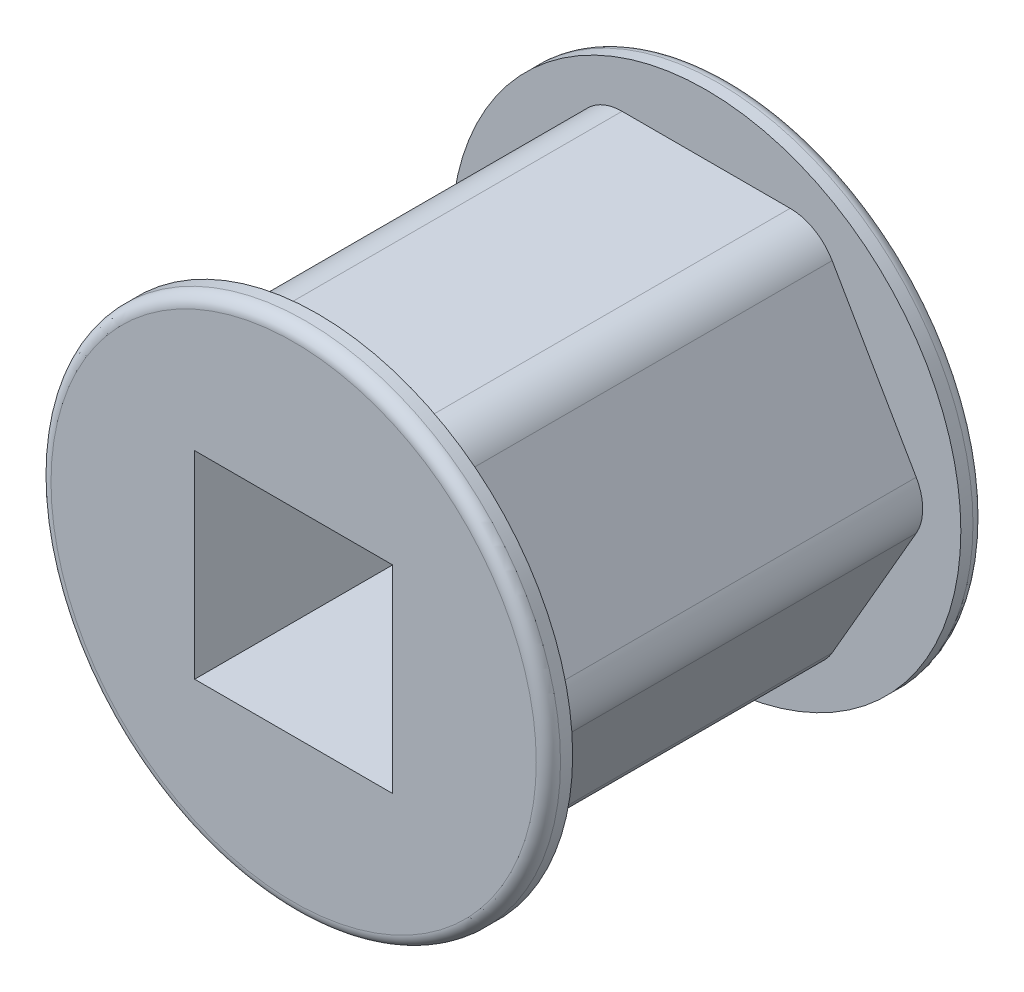
ISO-10303-21;
HEADER;
FILE_DESCRIPTION(('STEP AP214'),'2;1');
FILE_NAME('part.step','',(''),(''),'','','');
FILE_SCHEMA(('AUTOMOTIVE_DESIGN { 1 0 10303 214 1 1 1 1 }'));
ENDSEC;
DATA;
#1=APPLICATION_CONTEXT('core data for automotive mechanical design processes');
#2=APPLICATION_PROTOCOL_DEFINITION('international standard','automotive_design',2000,#1);
#3=PRODUCT_CONTEXT('',#1,'mechanical');
#4=PRODUCT('Part','Part','',(#3));
#5=PRODUCT_RELATED_PRODUCT_CATEGORY('part','',(#4));
#6=PRODUCT_DEFINITION_FORMATION('','',#4);
#7=PRODUCT_DEFINITION_CONTEXT('part definition',#1,'design');
#8=PRODUCT_DEFINITION('design','',#6,#7);
#9=PRODUCT_DEFINITION_SHAPE('','',#8);
#10=(LENGTH_UNIT() NAMED_UNIT(*) SI_UNIT(.MILLI.,.METRE.));
#11=(NAMED_UNIT(*) PLANE_ANGLE_UNIT() SI_UNIT($,.RADIAN.));
#12=(NAMED_UNIT(*) SI_UNIT($,.STERADIAN.) SOLID_ANGLE_UNIT());
#13=UNCERTAINTY_MEASURE_WITH_UNIT(LENGTH_MEASURE(1.E-05),#10,'distance_accuracy_value','');
#14=(GEOMETRIC_REPRESENTATION_CONTEXT(3) GLOBAL_UNCERTAINTY_ASSIGNED_CONTEXT((#13)) GLOBAL_UNIT_ASSIGNED_CONTEXT((#10,
#11,#12)) REPRESENTATION_CONTEXT('',''));
#15=CARTESIAN_POINT('',(0.,0.,0.));
#16=DIRECTION('',(0.,0.,1.));
#17=DIRECTION('',(1.,0.,0.));
#18=AXIS2_PLACEMENT_3D('',#15,#16,#17);
#19=CARTESIAN_POINT('',(3.2385,-3.2385,0.79375));
#20=DIRECTION('',(-1.,0.,0.));
#21=DIRECTION('',(0.,0.,1.));
#22=AXIS2_PLACEMENT_3D('',#19,#20,#21);
#23=PLANE('',#22);
#24=DIRECTION('',(0.,0.,-1.));
#25=VECTOR('',#24,1.);
#26=CARTESIAN_POINT('',(3.2385,3.2385,0.79375));
#27=LINE('',#26,#25);
#28=CARTESIAN_POINT('',(3.2385,3.2385,14.2875));
#29=VERTEX_POINT('',#28);
#30=CARTESIAN_POINT('',(3.2385,3.2385,0.));
#31=VERTEX_POINT('',#30);
#32=EDGE_CURVE('E170',#29,#31,#27,.T.);
#33=ORIENTED_EDGE('',*,*,#32,.T.);
#34=DIRECTION('',(0.,1.,0.));
#35=VECTOR('',#34,1.);
#36=CARTESIAN_POINT('',(3.2385,3.2385,0.));
#37=LINE('',#36,#35);
#38=CARTESIAN_POINT('',(3.2385,-3.2385,0.));
#39=VERTEX_POINT('',#38);
#40=EDGE_CURVE('E190',#39,#31,#37,.T.);
#41=ORIENTED_EDGE('',*,*,#40,.F.);
#42=DIRECTION('',(0.,0.,-1.));
#43=VECTOR('',#42,1.);
#44=CARTESIAN_POINT('',(3.2385,-3.2385,0.79375));
#45=LINE('',#44,#43);
#46=CARTESIAN_POINT('',(3.2385,-3.2385,14.2875));
#47=VERTEX_POINT('',#46);
#48=EDGE_CURVE('E260',#47,#39,#45,.T.);
#49=ORIENTED_EDGE('',*,*,#48,.F.);
#50=DIRECTION('',(0.,-1.,0.));
#51=VECTOR('',#50,1.);
#52=CARTESIAN_POINT('',(3.2385,3.2385,14.2875));
#53=LINE('',#52,#51);
#54=EDGE_CURVE('E185',#29,#47,#53,.T.);
#55=ORIENTED_EDGE('',*,*,#54,.F.);
#56=EDGE_LOOP('',(#33,#41,#49,#55));
#57=FACE_BOUND('',#56,.T.);
#58=ADVANCED_FACE('F43',(#57),#23,.T.);
#59=CARTESIAN_POINT('',(-3.2385,3.2385,0.79375));
#60=DIRECTION('',(0.,-1.,0.));
#61=DIRECTION('',(0.,0.,-1.));
#62=AXIS2_PLACEMENT_3D('',#59,#60,#61);
#63=PLANE('',#62);
#64=DIRECTION('',(0.,0.,-1.));
#65=VECTOR('',#64,1.);
#66=CARTESIAN_POINT('',(-3.2385,3.2385,0.79375));
#67=LINE('',#66,#65);
#68=CARTESIAN_POINT('',(-3.2385,3.2385,14.2875));
#69=VERTEX_POINT('',#68);
#70=CARTESIAN_POINT('',(-3.2385,3.2385,0.));
#71=VERTEX_POINT('',#70);
#72=EDGE_CURVE('E160',#69,#71,#67,.T.);
#73=ORIENTED_EDGE('',*,*,#72,.T.);
#74=DIRECTION('',(-1.,0.,0.));
#75=VECTOR('',#74,1.);
#76=CARTESIAN_POINT('',(-3.2385,3.2385,0.));
#77=LINE('',#76,#75);
#78=EDGE_CURVE('E188',#31,#71,#77,.T.);
#79=ORIENTED_EDGE('',*,*,#78,.F.);
#80=ORIENTED_EDGE('',*,*,#32,.F.);
#81=DIRECTION('',(1.,0.,0.));
#82=VECTOR('',#81,1.);
#83=CARTESIAN_POINT('',(-3.2385,3.2385,14.2875));
#84=LINE('',#83,#82);
#85=EDGE_CURVE('E174',#69,#29,#84,.T.);
#86=ORIENTED_EDGE('',*,*,#85,.F.);
#87=EDGE_LOOP('',(#73,#79,#80,#86));
#88=FACE_BOUND('',#87,.T.);
#89=ADVANCED_FACE('F181',(#88),#63,.T.);
#90=CARTESIAN_POINT('',(-3.2385,-3.2385,0.79375));
#91=DIRECTION('',(1.,0.,0.));
#92=DIRECTION('',(0.,0.,-1.));
#93=AXIS2_PLACEMENT_3D('',#90,#91,#92);
#94=PLANE('',#93);
#95=DIRECTION('',(0.,0.,-1.));
#96=VECTOR('',#95,1.);
#97=CARTESIAN_POINT('',(-3.2385,-3.2385,0.79375));
#98=LINE('',#97,#96);
#99=CARTESIAN_POINT('',(-3.2385,-3.2385,14.2875));
#100=VERTEX_POINT('',#99);
#101=CARTESIAN_POINT('',(-3.2385,-3.2385,0.));
#102=VERTEX_POINT('',#101);
#103=EDGE_CURVE('E166',#100,#102,#98,.T.);
#104=ORIENTED_EDGE('',*,*,#103,.T.);
#105=DIRECTION('',(0.,-1.,0.));
#106=VECTOR('',#105,1.);
#107=CARTESIAN_POINT('',(-3.2385,-3.2385,0.));
#108=LINE('',#107,#106);
#109=EDGE_CURVE('E162',#71,#102,#108,.T.);
#110=ORIENTED_EDGE('',*,*,#109,.F.);
#111=ORIENTED_EDGE('',*,*,#72,.F.);
#112=DIRECTION('',(0.,1.,0.));
#113=VECTOR('',#112,1.);
#114=CARTESIAN_POINT('',(-3.2385,-3.2385,14.2875));
#115=LINE('',#114,#113);
#116=EDGE_CURVE('E159',#100,#69,#115,.T.);
#117=ORIENTED_EDGE('',*,*,#116,.F.);
#118=EDGE_LOOP('',(#104,#110,#111,#117));
#119=FACE_BOUND('',#118,.T.);
#120=ADVANCED_FACE('F157',(#119),#94,.T.);
#121=CARTESIAN_POINT('',(-3.2385,-3.2385,0.79375));
#122=DIRECTION('',(0.,1.,0.));
#123=DIRECTION('',(0.,0.,1.));
#124=AXIS2_PLACEMENT_3D('',#121,#122,#123);
#125=PLANE('',#124);
#126=ORIENTED_EDGE('',*,*,#48,.T.);
#127=DIRECTION('',(1.,0.,0.));
#128=VECTOR('',#127,1.);
#129=CARTESIAN_POINT('',(3.2385,-3.2385,0.));
#130=LINE('',#129,#128);
#131=EDGE_CURVE('E177',#102,#39,#130,.T.);
#132=ORIENTED_EDGE('',*,*,#131,.F.);
#133=ORIENTED_EDGE('',*,*,#103,.F.);
#134=DIRECTION('',(-1.,0.,0.));
#135=VECTOR('',#134,1.);
#136=CARTESIAN_POINT('',(3.2385,-3.2385,14.2875));
#137=LINE('',#136,#135);
#138=EDGE_CURVE('E178',#47,#100,#137,.T.);
#139=ORIENTED_EDGE('',*,*,#138,.F.);
#140=EDGE_LOOP('',(#126,#132,#133,#139));
#141=FACE_BOUND('',#140,.T.);
#142=ADVANCED_FACE('F337',(#141),#125,.T.);
#143=CARTESIAN_POINT('',(0.,0.,0.79375));
#144=DIRECTION('',(0.,0.,1.));
#145=DIRECTION('',(1.,0.,0.));
#146=AXIS2_PLACEMENT_3D('',#143,#144,#145);
#147=PLANE('',#146);
#148=DIRECTION('',(0.5,0.866025403784439,0.));
#149=VECTOR('',#148,1.);
#150=CARTESIAN_POINT('',(3.66617420935412,-6.35,0.79375));
#151=LINE('',#150,#149);
#152=CARTESIAN_POINT('',(4.12444598552339,-5.55625,0.79375));
#153=VERTEX_POINT('',#152);
#154=CARTESIAN_POINT('',(6.87407664253898,-0.793749999999998,0.79375));
#155=VERTEX_POINT('',#154);
#156=EDGE_CURVE('E239',#153,#155,#151,.T.);
#157=ORIENTED_EDGE('',*,*,#156,.F.);
#158=CARTESIAN_POINT('',(2.74963065701559,-4.7625,0.79375));
#159=DIRECTION('',(0.,0.,1.));
#160=DIRECTION('',(1.,0.,0.));
#161=AXIS2_PLACEMENT_3D('',#158,#159,#160);
#162=CIRCLE('',#161,1.5875);
#163=CARTESIAN_POINT('',(2.74963065701559,-6.35,0.79375));
#164=VERTEX_POINT('',#163);
#165=EDGE_CURVE('E300',#153,#164,#162,.F.);
#166=ORIENTED_EDGE('',*,*,#165,.T.);
#167=DIRECTION('',(1.,0.,0.));
#168=VECTOR('',#167,1.);
#169=CARTESIAN_POINT('',(-3.66617420935412,-6.35,0.79375));
#170=LINE('',#169,#168);
#171=CARTESIAN_POINT('',(-2.74963065701559,-6.35,0.79375));
#172=VERTEX_POINT('',#171);
#173=EDGE_CURVE('E251',#172,#164,#170,.T.);
#174=ORIENTED_EDGE('',*,*,#173,.F.);
#175=CARTESIAN_POINT('',(-2.74963065701559,-4.7625,0.79375));
#176=DIRECTION('',(0.,0.,1.));
#177=DIRECTION('',(1.,0.,0.));
#178=AXIS2_PLACEMENT_3D('',#175,#176,#177);
#179=CIRCLE('',#178,1.5875);
#180=CARTESIAN_POINT('',(-4.12444598552339,-5.55625,0.79375));
#181=VERTEX_POINT('',#180);
#182=EDGE_CURVE('E294',#172,#181,#179,.F.);
#183=ORIENTED_EDGE('',*,*,#182,.T.);
#184=DIRECTION('',(0.5,-0.866025403784439,0.));
#185=VECTOR('',#184,1.);
#186=CARTESIAN_POINT('',(-7.33234841870825,0.,0.79375));
#187=LINE('',#186,#185);
#188=CARTESIAN_POINT('',(-6.87407664253898,-0.79375,0.79375));
#189=VERTEX_POINT('',#188);
#190=EDGE_CURVE('E252',#189,#181,#187,.T.);
#191=ORIENTED_EDGE('',*,*,#190,.F.);
#192=CARTESIAN_POINT('',(-5.49926131403119,0.,0.79375));
#193=DIRECTION('',(0.,0.,1.));
#194=DIRECTION('',(1.,0.,0.));
#195=AXIS2_PLACEMENT_3D('',#192,#193,#194);
#196=CIRCLE('',#195,1.5875);
#197=CARTESIAN_POINT('',(-6.87407664253898,0.793750000000001,0.79375));
#198=VERTEX_POINT('',#197);
#199=EDGE_CURVE('E291',#189,#198,#196,.F.);
#200=ORIENTED_EDGE('',*,*,#199,.T.);
#201=DIRECTION('',(-0.5,-0.866025403784439,0.));
#202=VECTOR('',#201,1.);
#203=CARTESIAN_POINT('',(-3.66617420935412,6.35,0.79375));
#204=LINE('',#203,#202);
#205=CARTESIAN_POINT('',(-4.12444598552339,5.55625,0.79375));
#206=VERTEX_POINT('',#205);
#207=EDGE_CURVE('E247',#206,#198,#204,.T.);
#208=ORIENTED_EDGE('',*,*,#207,.F.);
#209=CARTESIAN_POINT('',(-2.74963065701559,4.7625,0.79375));
#210=DIRECTION('',(0.,0.,1.));
#211=DIRECTION('',(1.,0.,0.));
#212=AXIS2_PLACEMENT_3D('',#209,#210,#211);
#213=CIRCLE('',#212,1.5875);
#214=CARTESIAN_POINT('',(-2.74963065701559,6.35,0.79375));
#215=VERTEX_POINT('',#214);
#216=EDGE_CURVE('E59',#206,#215,#213,.F.);
#217=ORIENTED_EDGE('',*,*,#216,.T.);
#218=DIRECTION('',(-1.,0.,0.));
#219=VECTOR('',#218,1.);
#220=CARTESIAN_POINT('',(3.66617420935412,6.35,0.79375));
#221=LINE('',#220,#219);
#222=CARTESIAN_POINT('',(2.74963065701559,6.35,0.79375));
#223=VERTEX_POINT('',#222);
#224=EDGE_CURVE('E246',#223,#215,#221,.T.);
#225=ORIENTED_EDGE('',*,*,#224,.F.);
#226=CARTESIAN_POINT('',(2.74963065701559,4.7625,0.79375));
#227=DIRECTION('',(0.,0.,1.));
#228=DIRECTION('',(1.,0.,0.));
#229=AXIS2_PLACEMENT_3D('',#226,#227,#228);
#230=CIRCLE('',#229,1.5875);
#231=CARTESIAN_POINT('',(4.12444598552339,5.55625,0.79375));
#232=VERTEX_POINT('',#231);
#233=EDGE_CURVE('E67',#223,#232,#230,.F.);
#234=ORIENTED_EDGE('',*,*,#233,.T.);
#235=DIRECTION('',(-0.5,0.866025403784438,0.));
#236=VECTOR('',#235,1.);
#237=CARTESIAN_POINT('',(7.33234841870825,0.,0.79375));
#238=LINE('',#237,#236);
#239=CARTESIAN_POINT('',(6.87407664253898,0.793750000000002,0.79375));
#240=VERTEX_POINT('',#239);
#241=EDGE_CURVE('E243',#240,#232,#238,.T.);
#242=ORIENTED_EDGE('',*,*,#241,.F.);
#243=CARTESIAN_POINT('',(5.49926131403119,0.,0.79375));
#244=DIRECTION('',(0.,0.,1.));
#245=DIRECTION('',(1.,0.,0.));
#246=AXIS2_PLACEMENT_3D('',#243,#244,#245);
#247=CIRCLE('',#246,1.5875);
#248=EDGE_CURVE('E299',#240,#155,#247,.F.);
#249=ORIENTED_EDGE('',*,*,#248,.T.);
#250=EDGE_LOOP('',(#157,#166,#174,#183,#191,#200,#208,#217,#225,#234,#242,#249));
#251=FACE_BOUND('',#250,.T.);
#252=CARTESIAN_POINT('',(0.,0.,0.79375));
#253=DIRECTION('',(0.,0.,1.));
#254=DIRECTION('',(1.,0.,0.));
#255=AXIS2_PLACEMENT_3D('',#252,#253,#254);
#256=CIRCLE('',#255,8.334375);
#257=CARTESIAN_POINT('',(8.334375,0.,0.79375));
#258=VERTEX_POINT('',#257);
#259=EDGE_CURVE('E262',#258,#258,#256,.T.);
#260=ORIENTED_EDGE('',*,*,#259,.T.);
#261=EDGE_LOOP('',(#260));
#262=FACE_BOUND('',#261,.T.);
#263=ADVANCED_FACE('F335',(#251,#262),#147,.T.);
#264=CARTESIAN_POINT('',(0.,0.,0.));
#265=DIRECTION('',(0.,0.,1.));
#266=DIRECTION('',(1.,0.,0.));
#267=AXIS2_PLACEMENT_3D('',#264,#265,#266);
#268=PLANE('',#267);
#269=CARTESIAN_POINT('',(0.,0.,0.));
#270=DIRECTION('',(0.,0.,1.));
#271=DIRECTION('',(1.,0.,0.));
#272=AXIS2_PLACEMENT_3D('',#269,#270,#271);
#273=CIRCLE('',#272,7.9375);
#274=CARTESIAN_POINT('',(7.9375,0.,0.));
#275=VERTEX_POINT('',#274);
#276=EDGE_CURVE('E11',#275,#275,#273,.F.);
#277=ORIENTED_EDGE('',*,*,#276,.T.);
#278=EDGE_LOOP('',(#277));
#279=FACE_BOUND('',#278,.T.);
#280=ORIENTED_EDGE('',*,*,#131,.T.);
#281=ORIENTED_EDGE('',*,*,#40,.T.);
#282=ORIENTED_EDGE('',*,*,#78,.T.);
#283=ORIENTED_EDGE('',*,*,#109,.T.);
#284=EDGE_LOOP('',(#280,#281,#282,#283));
#285=FACE_BOUND('',#284,.T.);
#286=ADVANCED_FACE('F334',(#279,#285),#268,.F.);
#287=CARTESIAN_POINT('',(0.,0.,0.79375));
#288=DIRECTION('',(0.,0.,-1.));
#289=DIRECTION('',(-1.,0.,0.));
#290=AXIS2_PLACEMENT_3D('',#287,#288,#289);
#291=CYLINDRICAL_SURFACE('',#290,8.334375);
#292=CARTESIAN_POINT('',(0.,0.,0.396875));
#293=DIRECTION('',(0.,0.,1.));
#294=DIRECTION('',(1.,0.,0.));
#295=AXIS2_PLACEMENT_3D('',#292,#293,#294);
#296=CIRCLE('',#295,8.334375);
#297=CARTESIAN_POINT('',(8.334375,0.,0.396875));
#298=VERTEX_POINT('',#297);
#299=EDGE_CURVE('E51',#298,#298,#296,.T.);
#300=ORIENTED_EDGE('',*,*,#299,.T.);
#301=EDGE_LOOP('',(#300));
#302=FACE_BOUND('',#301,.T.);
#303=ORIENTED_EDGE('',*,*,#259,.F.);
#304=EDGE_LOOP('',(#303));
#305=FACE_BOUND('',#304,.T.);
#306=ADVANCED_FACE('F304',(#302,#305),#291,.T.);
#307=CARTESIAN_POINT('',(3.66617420935412,-6.35,7.14375));
#308=DIRECTION('',(-0.866025403784439,0.5,0.));
#309=DIRECTION('',(-0.5,-0.866025403784439,0.));
#310=AXIS2_PLACEMENT_3D('',#307,#308,#309);
#311=PLANE('',#310);
#312=DIRECTION('',(0.,0.,-1.));
#313=VECTOR('',#312,1.);
#314=CARTESIAN_POINT('',(6.87407664253898,-0.793749999999998,7.14375));
#315=LINE('',#314,#313);
#316=CARTESIAN_POINT('',(6.87407664253898,-0.793749999999998,13.49375));
#317=VERTEX_POINT('',#316);
#318=EDGE_CURVE('E276',#155,#317,#315,.F.);
#319=ORIENTED_EDGE('',*,*,#318,.T.);
#320=DIRECTION('',(0.5,0.866025403784439,0.));
#321=VECTOR('',#320,1.);
#322=CARTESIAN_POINT('',(3.66617420935412,-6.35,13.49375));
#323=LINE('',#322,#321);
#324=CARTESIAN_POINT('',(4.12444598552339,-5.55625,13.49375));
#325=VERTEX_POINT('',#324);
#326=EDGE_CURVE('E191',#325,#317,#323,.T.);
#327=ORIENTED_EDGE('',*,*,#326,.F.);
#328=DIRECTION('',(0.,0.,-1.));
#329=VECTOR('',#328,1.);
#330=CARTESIAN_POINT('',(4.12444598552339,-5.55625,7.14375));
#331=LINE('',#330,#329);
#332=EDGE_CURVE('E282',#325,#153,#331,.T.);
#333=ORIENTED_EDGE('',*,*,#332,.T.);
#334=ORIENTED_EDGE('',*,*,#156,.T.);
#335=EDGE_LOOP('',(#319,#327,#333,#334));
#336=FACE_BOUND('',#335,.T.);
#337=ADVANCED_FACE('F342',(#336),#311,.F.);
#338=CARTESIAN_POINT('',(7.33234841870825,0.,7.14375));
#339=DIRECTION('',(-0.866025403784439,-0.5,0.));
#340=DIRECTION('',(0.5,-0.866025403784439,0.));
#341=AXIS2_PLACEMENT_3D('',#338,#339,#340);
#342=PLANE('',#341);
#343=DIRECTION('',(0.,0.,-1.));
#344=VECTOR('',#343,1.);
#345=CARTESIAN_POINT('',(4.12444598552339,5.55625,7.14375));
#346=LINE('',#345,#344);
#347=CARTESIAN_POINT('',(4.12444598552339,5.55625,13.49375));
#348=VERTEX_POINT('',#347);
#349=EDGE_CURVE('E281',#232,#348,#346,.F.);
#350=ORIENTED_EDGE('',*,*,#349,.T.);
#351=DIRECTION('',(-0.5,0.866025403784438,0.));
#352=VECTOR('',#351,1.);
#353=CARTESIAN_POINT('',(7.33234841870825,0.,13.49375));
#354=LINE('',#353,#352);
#355=CARTESIAN_POINT('',(6.87407664253898,0.793750000000002,13.49375));
#356=VERTEX_POINT('',#355);
#357=EDGE_CURVE('E199',#356,#348,#354,.T.);
#358=ORIENTED_EDGE('',*,*,#357,.F.);
#359=DIRECTION('',(0.,0.,-1.));
#360=VECTOR('',#359,1.);
#361=CARTESIAN_POINT('',(6.87407664253898,0.793750000000002,7.14375));
#362=LINE('',#361,#360);
#363=EDGE_CURVE('E288',#356,#240,#362,.T.);
#364=ORIENTED_EDGE('',*,*,#363,.T.);
#365=ORIENTED_EDGE('',*,*,#241,.T.);
#366=EDGE_LOOP('',(#350,#358,#364,#365));
#367=FACE_BOUND('',#366,.T.);
#368=ADVANCED_FACE('F375',(#367),#342,.F.);
#369=CARTESIAN_POINT('',(3.66617420935412,6.35,7.14375));
#370=DIRECTION('',(0.,-1.,0.));
#371=DIRECTION('',(1.,0.,0.));
#372=AXIS2_PLACEMENT_3D('',#369,#370,#371);
#373=PLANE('',#372);
#374=DIRECTION('',(0.,0.,-1.));
#375=VECTOR('',#374,1.);
#376=CARTESIAN_POINT('',(-2.74963065701559,6.35,7.14375));
#377=LINE('',#376,#375);
#378=CARTESIAN_POINT('',(-2.74963065701559,6.35,13.49375));
#379=VERTEX_POINT('',#378);
#380=EDGE_CURVE('E287',#215,#379,#377,.F.);
#381=ORIENTED_EDGE('',*,*,#380,.T.);
#382=DIRECTION('',(-1.,0.,0.));
#383=VECTOR('',#382,1.);
#384=CARTESIAN_POINT('',(3.66617420935412,6.35,13.49375));
#385=LINE('',#384,#383);
#386=CARTESIAN_POINT('',(2.74963065701559,6.35,13.49375));
#387=VERTEX_POINT('',#386);
#388=EDGE_CURVE('E203',#387,#379,#385,.T.);
#389=ORIENTED_EDGE('',*,*,#388,.F.);
#390=DIRECTION('',(0.,0.,-1.));
#391=VECTOR('',#390,1.);
#392=CARTESIAN_POINT('',(2.74963065701559,6.35,7.14375));
#393=LINE('',#392,#391);
#394=EDGE_CURVE('E293',#387,#223,#393,.T.);
#395=ORIENTED_EDGE('',*,*,#394,.T.);
#396=ORIENTED_EDGE('',*,*,#224,.T.);
#397=EDGE_LOOP('',(#381,#389,#395,#396));
#398=FACE_BOUND('',#397,.T.);
#399=ADVANCED_FACE('F362',(#398),#373,.F.);
#400=CARTESIAN_POINT('',(-3.66617420935412,6.35,7.14375));
#401=DIRECTION('',(0.866025403784439,-0.5,0.));
#402=DIRECTION('',(0.5,0.866025403784439,0.));
#403=AXIS2_PLACEMENT_3D('',#400,#401,#402);
#404=PLANE('',#403);
#405=ORIENTED_EDGE('',*,*,#207,.T.);
#406=DIRECTION('',(0.,0.,-1.));
#407=VECTOR('',#406,1.);
#408=CARTESIAN_POINT('',(-6.87407664253898,0.793749999999999,7.14375));
#409=LINE('',#408,#407);
#410=CARTESIAN_POINT('',(-6.87407664253898,0.793750000000001,13.49375));
#411=VERTEX_POINT('',#410);
#412=EDGE_CURVE('E275',#198,#411,#409,.F.);
#413=ORIENTED_EDGE('',*,*,#412,.T.);
#414=DIRECTION('',(-0.5,-0.866025403784439,0.));
#415=VECTOR('',#414,1.);
#416=CARTESIAN_POINT('',(-3.66617420935412,6.35,13.49375));
#417=LINE('',#416,#415);
#418=CARTESIAN_POINT('',(-4.12444598552339,5.55625,13.49375));
#419=VERTEX_POINT('',#418);
#420=EDGE_CURVE('E202',#419,#411,#417,.T.);
#421=ORIENTED_EDGE('',*,*,#420,.F.);
#422=DIRECTION('',(0.,0.,-1.));
#423=VECTOR('',#422,1.);
#424=CARTESIAN_POINT('',(-4.12444598552339,5.55625,7.14375));
#425=LINE('',#424,#423);
#426=EDGE_CURVE('E267',#419,#206,#425,.T.);
#427=ORIENTED_EDGE('',*,*,#426,.T.);
#428=EDGE_LOOP('',(#405,#413,#421,#427));
#429=FACE_BOUND('',#428,.T.);
#430=ADVANCED_FACE('F378',(#429),#404,.F.);
#431=CARTESIAN_POINT('',(-7.33234841870825,0.,7.14375));
#432=DIRECTION('',(0.866025403784439,0.5,0.));
#433=DIRECTION('',(-0.5,0.866025403784439,0.));
#434=AXIS2_PLACEMENT_3D('',#431,#432,#433);
#435=PLANE('',#434);
#436=DIRECTION('',(0.,0.,-1.));
#437=VECTOR('',#436,1.);
#438=CARTESIAN_POINT('',(-4.12444598552339,-5.55625,7.14375));
#439=LINE('',#438,#437);
#440=CARTESIAN_POINT('',(-4.12444598552339,-5.55625,13.49375));
#441=VERTEX_POINT('',#440);
#442=EDGE_CURVE('E261',#181,#441,#439,.F.);
#443=ORIENTED_EDGE('',*,*,#442,.T.);
#444=DIRECTION('',(0.5,-0.866025403784439,0.));
#445=VECTOR('',#444,1.);
#446=CARTESIAN_POINT('',(-7.33234841870825,0.,13.49375));
#447=LINE('',#446,#445);
#448=CARTESIAN_POINT('',(-6.87407664253898,-0.79375,13.49375));
#449=VERTEX_POINT('',#448);
#450=EDGE_CURVE('E210',#449,#441,#447,.T.);
#451=ORIENTED_EDGE('',*,*,#450,.F.);
#452=DIRECTION('',(0.,0.,-1.));
#453=VECTOR('',#452,1.);
#454=CARTESIAN_POINT('',(-6.87407664253898,-0.79375,7.14375));
#455=LINE('',#454,#453);
#456=EDGE_CURVE('E268',#449,#189,#455,.T.);
#457=ORIENTED_EDGE('',*,*,#456,.T.);
#458=ORIENTED_EDGE('',*,*,#190,.T.);
#459=EDGE_LOOP('',(#443,#451,#457,#458));
#460=FACE_BOUND('',#459,.T.);
#461=ADVANCED_FACE('F381',(#460),#435,.F.);
#462=CARTESIAN_POINT('',(-3.66617420935412,-6.35,7.14375));
#463=DIRECTION('',(0.,1.,0.));
#464=DIRECTION('',(0.,0.,1.));
#465=AXIS2_PLACEMENT_3D('',#462,#463,#464);
#466=PLANE('',#465);
#467=DIRECTION('',(0.,0.,-1.));
#468=VECTOR('',#467,1.);
#469=CARTESIAN_POINT('',(2.74963065701559,-6.35,7.14375));
#470=LINE('',#469,#468);
#471=CARTESIAN_POINT('',(2.74963065701559,-6.35,13.49375));
#472=VERTEX_POINT('',#471);
#473=EDGE_CURVE('E274',#164,#472,#470,.F.);
#474=ORIENTED_EDGE('',*,*,#473,.T.);
#475=DIRECTION('',(1.,0.,0.));
#476=VECTOR('',#475,1.);
#477=CARTESIAN_POINT('',(-3.66617420935412,-6.35,13.49375));
#478=LINE('',#477,#476);
#479=CARTESIAN_POINT('',(-2.74963065701559,-6.35,13.49375));
#480=VERTEX_POINT('',#479);
#481=EDGE_CURVE('E208',#480,#472,#478,.T.);
#482=ORIENTED_EDGE('',*,*,#481,.F.);
#483=DIRECTION('',(0.,0.,-1.));
#484=VECTOR('',#483,1.);
#485=CARTESIAN_POINT('',(-2.74963065701559,-6.35,7.14375));
#486=LINE('',#485,#484);
#487=EDGE_CURVE('E277',#480,#172,#486,.T.);
#488=ORIENTED_EDGE('',*,*,#487,.T.);
#489=ORIENTED_EDGE('',*,*,#173,.T.);
#490=EDGE_LOOP('',(#474,#482,#488,#489));
#491=FACE_BOUND('',#490,.T.);
#492=ADVANCED_FACE('F347',(#491),#466,.F.);
#493=CARTESIAN_POINT('',(-5.49926131403119,0.,7.14375));
#494=DIRECTION('',(0.,0.,-1.));
#495=DIRECTION('',(-1.,0.,0.));
#496=AXIS2_PLACEMENT_3D('',#493,#494,#495);
#497=CYLINDRICAL_SURFACE('',#496,1.5875);
#498=ORIENTED_EDGE('',*,*,#456,.F.);
#499=CARTESIAN_POINT('',(-5.49926131403119,0.,13.49375));
#500=DIRECTION('',(0.,0.,1.));
#501=DIRECTION('',(1.,0.,0.));
#502=AXIS2_PLACEMENT_3D('',#499,#500,#501);
#503=CIRCLE('',#502,1.5875);
#504=EDGE_CURVE('E217',#449,#411,#503,.F.);
#505=ORIENTED_EDGE('',*,*,#504,.T.);
#506=ORIENTED_EDGE('',*,*,#412,.F.);
#507=ORIENTED_EDGE('',*,*,#199,.F.);
#508=EDGE_LOOP('',(#498,#505,#506,#507));
#509=FACE_BOUND('',#508,.T.);
#510=ADVANCED_FACE('F345',(#509),#497,.T.);
#511=CARTESIAN_POINT('',(-2.74963065701559,-4.7625,7.14375));
#512=DIRECTION('',(0.,0.,-1.));
#513=DIRECTION('',(-1.,0.,0.));
#514=AXIS2_PLACEMENT_3D('',#511,#512,#513);
#515=CYLINDRICAL_SURFACE('',#514,1.5875);
#516=ORIENTED_EDGE('',*,*,#487,.F.);
#517=CARTESIAN_POINT('',(-2.74963065701559,-4.7625,13.49375));
#518=DIRECTION('',(0.,0.,1.));
#519=DIRECTION('',(1.,0.,0.));
#520=AXIS2_PLACEMENT_3D('',#517,#518,#519);
#521=CIRCLE('',#520,1.5875);
#522=EDGE_CURVE('E216',#480,#441,#521,.F.);
#523=ORIENTED_EDGE('',*,*,#522,.T.);
#524=ORIENTED_EDGE('',*,*,#442,.F.);
#525=ORIENTED_EDGE('',*,*,#182,.F.);
#526=EDGE_LOOP('',(#516,#523,#524,#525));
#527=FACE_BOUND('',#526,.T.);
#528=ADVANCED_FACE('F343',(#527),#515,.T.);
#529=CARTESIAN_POINT('',(2.74963065701559,-4.7625,7.14375));
#530=DIRECTION('',(0.,0.,-1.));
#531=DIRECTION('',(-1.,0.,0.));
#532=AXIS2_PLACEMENT_3D('',#529,#530,#531);
#533=CYLINDRICAL_SURFACE('',#532,1.5875);
#534=ORIENTED_EDGE('',*,*,#332,.F.);
#535=CARTESIAN_POINT('',(2.74963065701559,-4.7625,13.49375));
#536=DIRECTION('',(0.,0.,1.));
#537=DIRECTION('',(1.,0.,0.));
#538=AXIS2_PLACEMENT_3D('',#535,#536,#537);
#539=CIRCLE('',#538,1.5875);
#540=EDGE_CURVE('E225',#325,#472,#539,.F.);
#541=ORIENTED_EDGE('',*,*,#540,.T.);
#542=ORIENTED_EDGE('',*,*,#473,.F.);
#543=ORIENTED_EDGE('',*,*,#165,.F.);
#544=EDGE_LOOP('',(#534,#541,#542,#543));
#545=FACE_BOUND('',#544,.T.);
#546=ADVANCED_FACE('F348',(#545),#533,.T.);
#547=CARTESIAN_POINT('',(5.49926131403119,0.,7.14375));
#548=DIRECTION('',(0.,0.,-1.));
#549=DIRECTION('',(-1.,0.,0.));
#550=AXIS2_PLACEMENT_3D('',#547,#548,#549);
#551=CYLINDRICAL_SURFACE('',#550,1.5875);
#552=ORIENTED_EDGE('',*,*,#363,.F.);
#553=CARTESIAN_POINT('',(5.49926131403119,0.,13.49375));
#554=DIRECTION('',(0.,0.,1.));
#555=DIRECTION('',(1.,0.,0.));
#556=AXIS2_PLACEMENT_3D('',#553,#554,#555);
#557=CIRCLE('',#556,1.5875);
#558=EDGE_CURVE('E224',#356,#317,#557,.F.);
#559=ORIENTED_EDGE('',*,*,#558,.T.);
#560=ORIENTED_EDGE('',*,*,#318,.F.);
#561=ORIENTED_EDGE('',*,*,#248,.F.);
#562=EDGE_LOOP('',(#552,#559,#560,#561));
#563=FACE_BOUND('',#562,.T.);
#564=ADVANCED_FACE('F352',(#563),#551,.T.);
#565=CARTESIAN_POINT('',(2.74963065701559,4.7625,7.14375));
#566=DIRECTION('',(0.,0.,-1.));
#567=DIRECTION('',(-1.,0.,0.));
#568=AXIS2_PLACEMENT_3D('',#565,#566,#567);
#569=CYLINDRICAL_SURFACE('',#568,1.5875);
#570=ORIENTED_EDGE('',*,*,#394,.F.);
#571=CARTESIAN_POINT('',(2.74963065701559,4.7625,13.49375));
#572=DIRECTION('',(0.,0.,1.));
#573=DIRECTION('',(1.,0.,0.));
#574=AXIS2_PLACEMENT_3D('',#571,#572,#573);
#575=CIRCLE('',#574,1.5875);
#576=EDGE_CURVE('E226',#387,#348,#575,.F.);
#577=ORIENTED_EDGE('',*,*,#576,.T.);
#578=ORIENTED_EDGE('',*,*,#349,.F.);
#579=ORIENTED_EDGE('',*,*,#233,.F.);
#580=EDGE_LOOP('',(#570,#577,#578,#579));
#581=FACE_BOUND('',#580,.T.);
#582=ADVANCED_FACE('F316',(#581),#569,.T.);
#583=CARTESIAN_POINT('',(-2.74963065701559,4.7625,7.14375));
#584=DIRECTION('',(0.,0.,-1.));
#585=DIRECTION('',(-1.,0.,0.));
#586=AXIS2_PLACEMENT_3D('',#583,#584,#585);
#587=CYLINDRICAL_SURFACE('',#586,1.5875);
#588=ORIENTED_EDGE('',*,*,#426,.F.);
#589=CARTESIAN_POINT('',(-2.74963065701559,4.7625,13.49375));
#590=DIRECTION('',(0.,0.,1.));
#591=DIRECTION('',(1.,0.,0.));
#592=AXIS2_PLACEMENT_3D('',#589,#590,#591);
#593=CIRCLE('',#592,1.5875);
#594=EDGE_CURVE('E233',#419,#379,#593,.F.);
#595=ORIENTED_EDGE('',*,*,#594,.T.);
#596=ORIENTED_EDGE('',*,*,#380,.F.);
#597=ORIENTED_EDGE('',*,*,#216,.F.);
#598=EDGE_LOOP('',(#588,#595,#596,#597));
#599=FACE_BOUND('',#598,.T.);
#600=ADVANCED_FACE('F309',(#599),#587,.T.);
#601=CARTESIAN_POINT('',(0.,0.,0.396875));
#602=DIRECTION('',(0.,0.,1.));
#603=DIRECTION('',(1.,0.,0.));
#604=AXIS2_PLACEMENT_3D('',#601,#602,#603);
#605=TOROIDAL_SURFACE('',#604,7.9375,0.396875);
#606=ORIENTED_EDGE('',*,*,#276,.F.);
#607=EDGE_LOOP('',(#606));
#608=FACE_BOUND('',#607,.T.);
#609=ORIENTED_EDGE('',*,*,#299,.F.);
#610=EDGE_LOOP('',(#609));
#611=FACE_BOUND('',#610,.T.);
#612=ADVANCED_FACE('F44',(#608,#611),#605,.T.);
#613=CARTESIAN_POINT('',(0.,0.,13.49375));
#614=DIRECTION('',(0.,0.,-1.));
#615=DIRECTION('',(1.,0.,0.));
#616=AXIS2_PLACEMENT_3D('',#613,#614,#615);
#617=PLANE('',#616);
#618=ORIENTED_EDGE('',*,*,#326,.T.);
#619=ORIENTED_EDGE('',*,*,#558,.F.);
#620=ORIENTED_EDGE('',*,*,#357,.T.);
#621=ORIENTED_EDGE('',*,*,#576,.F.);
#622=ORIENTED_EDGE('',*,*,#388,.T.);
#623=ORIENTED_EDGE('',*,*,#594,.F.);
#624=ORIENTED_EDGE('',*,*,#420,.T.);
#625=ORIENTED_EDGE('',*,*,#504,.F.);
#626=ORIENTED_EDGE('',*,*,#450,.T.);
#627=ORIENTED_EDGE('',*,*,#522,.F.);
#628=ORIENTED_EDGE('',*,*,#481,.T.);
#629=ORIENTED_EDGE('',*,*,#540,.F.);
#630=EDGE_LOOP('',(#618,#619,#620,#621,#622,#623,#624,#625,#626,#627,#628,#629));
#631=FACE_BOUND('',#630,.T.);
#632=CARTESIAN_POINT('',(0.,0.,13.49375));
#633=DIRECTION('',(0.,0.,1.));
#634=DIRECTION('',(1.,0.,0.));
#635=AXIS2_PLACEMENT_3D('',#632,#633,#634);
#636=CIRCLE('',#635,8.334375);
#637=CARTESIAN_POINT('',(8.334375,0.,13.49375));
#638=VERTEX_POINT('',#637);
#639=EDGE_CURVE('E214',#638,#638,#636,.T.);
#640=ORIENTED_EDGE('',*,*,#639,.F.);
#641=EDGE_LOOP('',(#640));
#642=FACE_BOUND('',#641,.T.);
#643=ADVANCED_FACE('F307',(#631,#642),#617,.T.);
#644=CARTESIAN_POINT('',(0.,0.,14.2875));
#645=DIRECTION('',(0.,0.,-1.));
#646=DIRECTION('',(1.,0.,0.));
#647=AXIS2_PLACEMENT_3D('',#644,#645,#646);
#648=PLANE('',#647);
#649=CARTESIAN_POINT('',(0.,0.,14.2875));
#650=DIRECTION('',(0.,0.,1.));
#651=DIRECTION('',(1.,0.,0.));
#652=AXIS2_PLACEMENT_3D('',#649,#650,#651);
#653=CIRCLE('',#652,7.9375);
#654=CARTESIAN_POINT('',(7.9375,0.,14.2875));
#655=VERTEX_POINT('',#654);
#656=EDGE_CURVE('E240',#655,#655,#653,.F.);
#657=ORIENTED_EDGE('',*,*,#656,.F.);
#658=EDGE_LOOP('',(#657));
#659=FACE_BOUND('',#658,.T.);
#660=ORIENTED_EDGE('',*,*,#85,.T.);
#661=ORIENTED_EDGE('',*,*,#54,.T.);
#662=ORIENTED_EDGE('',*,*,#138,.T.);
#663=ORIENTED_EDGE('',*,*,#116,.T.);
#664=EDGE_LOOP('',(#660,#661,#662,#663));
#665=FACE_BOUND('',#664,.T.);
#666=ADVANCED_FACE('F173',(#659,#665),#648,.F.);
#667=CARTESIAN_POINT('',(0.,0.,13.49375));
#668=DIRECTION('',(0.,0.,1.));
#669=DIRECTION('',(-1.,0.,0.));
#670=AXIS2_PLACEMENT_3D('',#667,#668,#669);
#671=CYLINDRICAL_SURFACE('',#670,8.334375);
#672=CARTESIAN_POINT('',(0.,0.,13.890625));
#673=DIRECTION('',(0.,0.,1.));
#674=DIRECTION('',(1.,0.,0.));
#675=AXIS2_PLACEMENT_3D('',#672,#673,#674);
#676=CIRCLE('',#675,8.334375);
#677=CARTESIAN_POINT('',(8.334375,0.,13.890625));
#678=VERTEX_POINT('',#677);
#679=EDGE_CURVE('E234',#678,#678,#676,.T.);
#680=ORIENTED_EDGE('',*,*,#679,.F.);
#681=EDGE_LOOP('',(#680));
#682=FACE_BOUND('',#681,.T.);
#683=ORIENTED_EDGE('',*,*,#639,.T.);
#684=EDGE_LOOP('',(#683));
#685=FACE_BOUND('',#684,.T.);
#686=ADVANCED_FACE('F422',(#682,#685),#671,.T.);
#687=CARTESIAN_POINT('',(0.,0.,13.890625));
#688=DIRECTION('',(0.,0.,-1.));
#689=DIRECTION('',(1.,0.,0.));
#690=AXIS2_PLACEMENT_3D('',#687,#688,#689);
#691=TOROIDAL_SURFACE('',#690,7.9375,0.396875);
#692=ORIENTED_EDGE('',*,*,#656,.T.);
#693=EDGE_LOOP('',(#692));
#694=FACE_BOUND('',#693,.T.);
#695=ORIENTED_EDGE('',*,*,#679,.T.);
#696=EDGE_LOOP('',(#695));
#697=FACE_BOUND('',#696,.T.);
#698=ADVANCED_FACE('F442',(#694,#697),#691,.T.);
#699=CLOSED_SHELL('',(#58,#89,#120,#142,#263,#286,#306,#337,#368,#399,#430,#461,#492,#510,#528,
#546,#564,#582,#600,#612,#643,#666,#686,#698));
#700=MANIFOLD_SOLID_BREP('B2',#699);
#701=ADVANCED_BREP_SHAPE_REPRESENTATION('',(#18,#700),#14);
#702=SHAPE_DEFINITION_REPRESENTATION(#9,#701);
ENDSEC;
END-ISO-10303-21;
